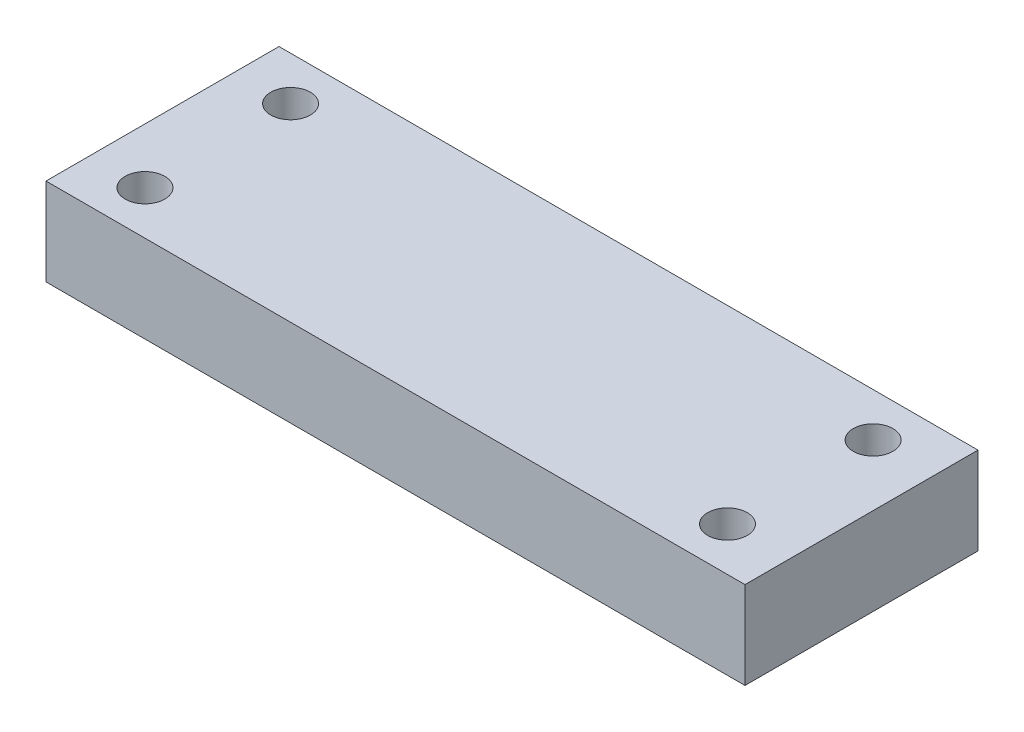
ISO-10303-21;
HEADER;
FILE_DESCRIPTION(('STEP AP214'),'2;1');
FILE_NAME('part.step','',(''),(''),'','','');
FILE_SCHEMA(('AUTOMOTIVE_DESIGN { 1 0 10303 214 1 1 1 1 }'));
ENDSEC;
DATA;
#1=APPLICATION_CONTEXT('core data for automotive mechanical design processes');
#2=APPLICATION_PROTOCOL_DEFINITION('international standard','automotive_design',2000,#1);
#3=PRODUCT_CONTEXT('',#1,'mechanical');
#4=PRODUCT('Part','Part','',(#3));
#5=PRODUCT_RELATED_PRODUCT_CATEGORY('part','',(#4));
#6=PRODUCT_DEFINITION_FORMATION('','',#4);
#7=PRODUCT_DEFINITION_CONTEXT('part definition',#1,'design');
#8=PRODUCT_DEFINITION('design','',#6,#7);
#9=PRODUCT_DEFINITION_SHAPE('','',#8);
#10=(LENGTH_UNIT() NAMED_UNIT(*) SI_UNIT(.MILLI.,.METRE.));
#11=(NAMED_UNIT(*) PLANE_ANGLE_UNIT() SI_UNIT($,.RADIAN.));
#12=(NAMED_UNIT(*) SI_UNIT($,.STERADIAN.) SOLID_ANGLE_UNIT());
#13=UNCERTAINTY_MEASURE_WITH_UNIT(LENGTH_MEASURE(1.E-05),#10,'distance_accuracy_value','');
#14=(GEOMETRIC_REPRESENTATION_CONTEXT(3) GLOBAL_UNCERTAINTY_ASSIGNED_CONTEXT((#13)) GLOBAL_UNIT_ASSIGNED_CONTEXT((#10,
#11,#12)) REPRESENTATION_CONTEXT('',''));
#15=CARTESIAN_POINT('',(0.,0.,0.));
#16=DIRECTION('',(0.,0.,1.));
#17=DIRECTION('',(1.,0.,0.));
#18=AXIS2_PLACEMENT_3D('',#15,#16,#17);
#19=CARTESIAN_POINT('',(-38.1,9.525,-12.7));
#20=DIRECTION('',(1.,0.,0.));
#21=DIRECTION('',(0.,0.,-1.));
#22=AXIS2_PLACEMENT_3D('',#19,#20,#21);
#23=PLANE('',#22);
#24=DIRECTION('',(0.,0.,1.));
#25=VECTOR('',#24,1.);
#26=CARTESIAN_POINT('',(-38.1,0.,-12.7));
#27=LINE('',#26,#25);
#28=CARTESIAN_POINT('',(-38.1,0.,-12.7));
#29=VERTEX_POINT('',#28);
#30=CARTESIAN_POINT('',(-38.1,0.,12.7));
#31=VERTEX_POINT('',#30);
#32=EDGE_CURVE('E98',#29,#31,#27,.T.);
#33=ORIENTED_EDGE('',*,*,#32,.T.);
#34=DIRECTION('',(0.,-1.,0.));
#35=VECTOR('',#34,1.);
#36=CARTESIAN_POINT('',(-38.1,9.525,12.7));
#37=LINE('',#36,#35);
#38=CARTESIAN_POINT('',(-38.1,9.525,12.7));
#39=VERTEX_POINT('',#38);
#40=EDGE_CURVE('E11',#39,#31,#37,.T.);
#41=ORIENTED_EDGE('',*,*,#40,.F.);
#42=DIRECTION('',(0.,0.,1.));
#43=VECTOR('',#42,1.);
#44=CARTESIAN_POINT('',(-38.1,9.525,-12.7));
#45=LINE('',#44,#43);
#46=CARTESIAN_POINT('',(-38.1,9.525,-12.7));
#47=VERTEX_POINT('',#46);
#48=EDGE_CURVE('E86',#47,#39,#45,.T.);
#49=ORIENTED_EDGE('',*,*,#48,.F.);
#50=DIRECTION('',(0.,-1.,0.));
#51=VECTOR('',#50,1.);
#52=CARTESIAN_POINT('',(-38.1,9.525,-12.7));
#53=LINE('',#52,#51);
#54=EDGE_CURVE('E94',#47,#29,#53,.T.);
#55=ORIENTED_EDGE('',*,*,#54,.T.);
#56=EDGE_LOOP('',(#33,#41,#49,#55));
#57=FACE_BOUND('',#56,.T.);
#58=ADVANCED_FACE('F35',(#57),#23,.F.);
#59=CARTESIAN_POINT('',(-38.1,9.525,12.7));
#60=DIRECTION('',(0.,0.,-1.));
#61=DIRECTION('',(-1.,0.,0.));
#62=AXIS2_PLACEMENT_3D('',#59,#60,#61);
#63=PLANE('',#62);
#64=DIRECTION('',(1.,0.,0.));
#65=VECTOR('',#64,1.);
#66=CARTESIAN_POINT('',(-38.1,0.,12.7));
#67=LINE('',#66,#65);
#68=CARTESIAN_POINT('',(38.1,0.,12.7));
#69=VERTEX_POINT('',#68);
#70=EDGE_CURVE('E90',#31,#69,#67,.T.);
#71=ORIENTED_EDGE('',*,*,#70,.T.);
#72=DIRECTION('',(0.,-1.,0.));
#73=VECTOR('',#72,1.);
#74=CARTESIAN_POINT('',(38.1,9.525,12.7));
#75=LINE('',#74,#73);
#76=CARTESIAN_POINT('',(38.1,9.525,12.7));
#77=VERTEX_POINT('',#76);
#78=EDGE_CURVE('E43',#77,#69,#75,.T.);
#79=ORIENTED_EDGE('',*,*,#78,.F.);
#80=DIRECTION('',(1.,0.,0.));
#81=VECTOR('',#80,1.);
#82=CARTESIAN_POINT('',(-38.1,9.525,12.7));
#83=LINE('',#82,#81);
#84=EDGE_CURVE('E81',#39,#77,#83,.T.);
#85=ORIENTED_EDGE('',*,*,#84,.F.);
#86=ORIENTED_EDGE('',*,*,#40,.T.);
#87=EDGE_LOOP('',(#71,#79,#85,#86));
#88=FACE_BOUND('',#87,.T.);
#89=ADVANCED_FACE('F89',(#88),#63,.F.);
#90=CARTESIAN_POINT('',(38.1,9.525,-12.7));
#91=DIRECTION('',(-1.,0.,0.));
#92=DIRECTION('',(0.,0.,1.));
#93=AXIS2_PLACEMENT_3D('',#90,#91,#92);
#94=PLANE('',#93);
#95=DIRECTION('',(0.,0.,-1.));
#96=VECTOR('',#95,1.);
#97=CARTESIAN_POINT('',(38.1,0.,-12.7));
#98=LINE('',#97,#96);
#99=CARTESIAN_POINT('',(38.1,0.,-12.7));
#100=VERTEX_POINT('',#99);
#101=EDGE_CURVE('E68',#69,#100,#98,.T.);
#102=ORIENTED_EDGE('',*,*,#101,.T.);
#103=DIRECTION('',(0.,-1.,0.));
#104=VECTOR('',#103,1.);
#105=CARTESIAN_POINT('',(38.1,9.525,-12.7));
#106=LINE('',#105,#104);
#107=CARTESIAN_POINT('',(38.1,9.525,-12.7));
#108=VERTEX_POINT('',#107);
#109=EDGE_CURVE('E91',#108,#100,#106,.T.);
#110=ORIENTED_EDGE('',*,*,#109,.F.);
#111=DIRECTION('',(0.,0.,-1.));
#112=VECTOR('',#111,1.);
#113=CARTESIAN_POINT('',(38.1,9.525,-12.7));
#114=LINE('',#113,#112);
#115=EDGE_CURVE('E84',#77,#108,#114,.T.);
#116=ORIENTED_EDGE('',*,*,#115,.F.);
#117=ORIENTED_EDGE('',*,*,#78,.T.);
#118=EDGE_LOOP('',(#102,#110,#116,#117));
#119=FACE_BOUND('',#118,.T.);
#120=ADVANCED_FACE('F92',(#119),#94,.F.);
#121=CARTESIAN_POINT('',(-38.1,9.525,-12.7));
#122=DIRECTION('',(0.,0.,1.));
#123=DIRECTION('',(1.,0.,0.));
#124=AXIS2_PLACEMENT_3D('',#121,#122,#123);
#125=PLANE('',#124);
#126=DIRECTION('',(-1.,0.,0.));
#127=VECTOR('',#126,1.);
#128=CARTESIAN_POINT('',(-38.1,0.,-12.7));
#129=LINE('',#128,#127);
#130=EDGE_CURVE('E74',#100,#29,#129,.T.);
#131=ORIENTED_EDGE('',*,*,#130,.T.);
#132=ORIENTED_EDGE('',*,*,#54,.F.);
#133=DIRECTION('',(-1.,0.,0.));
#134=VECTOR('',#133,1.);
#135=CARTESIAN_POINT('',(-38.1,9.525,-12.7));
#136=LINE('',#135,#134);
#137=EDGE_CURVE('E51',#108,#47,#136,.T.);
#138=ORIENTED_EDGE('',*,*,#137,.F.);
#139=ORIENTED_EDGE('',*,*,#109,.T.);
#140=EDGE_LOOP('',(#131,#132,#138,#139));
#141=FACE_BOUND('',#140,.T.);
#142=ADVANCED_FACE('F106',(#141),#125,.F.);
#143=CARTESIAN_POINT('',(0.,9.525,0.));
#144=DIRECTION('',(0.,1.,0.));
#145=DIRECTION('',(0.,0.,1.));
#146=AXIS2_PLACEMENT_3D('',#143,#144,#145);
#147=PLANE('',#146);
#148=CARTESIAN_POINT('',(31.4259241176133,9.525,7.9375));
#149=DIRECTION('',(0.,1.,0.));
#150=DIRECTION('',(0.,0.,1.));
#151=AXIS2_PLACEMENT_3D('',#148,#149,#150);
#152=CIRCLE('',#151,2.159);
#153=CARTESIAN_POINT('',(31.4259241176133,9.525,10.0965));
#154=VERTEX_POINT('',#153);
#155=EDGE_CURVE('E130',#154,#154,#152,.T.);
#156=ORIENTED_EDGE('',*,*,#155,.F.);
#157=EDGE_LOOP('',(#156));
#158=FACE_BOUND('',#157,.T.);
#159=CARTESIAN_POINT('',(31.4259241176133,9.525,-7.9375));
#160=DIRECTION('',(0.,1.,0.));
#161=DIRECTION('',(0.,0.,1.));
#162=AXIS2_PLACEMENT_3D('',#159,#160,#161);
#163=CIRCLE('',#162,2.159);
#164=CARTESIAN_POINT('',(31.4259241176133,9.525,-5.7785));
#165=VERTEX_POINT('',#164);
#166=EDGE_CURVE('E124',#165,#165,#163,.T.);
#167=ORIENTED_EDGE('',*,*,#166,.F.);
#168=EDGE_LOOP('',(#167));
#169=FACE_BOUND('',#168,.T.);
#170=CARTESIAN_POINT('',(-32.0740758823868,9.525,7.9375));
#171=DIRECTION('',(0.,1.,0.));
#172=DIRECTION('',(0.,0.,1.));
#173=AXIS2_PLACEMENT_3D('',#170,#171,#172);
#174=CIRCLE('',#173,2.159);
#175=CARTESIAN_POINT('',(-32.0740758823868,9.525,10.0965));
#176=VERTEX_POINT('',#175);
#177=EDGE_CURVE('E118',#176,#176,#174,.T.);
#178=ORIENTED_EDGE('',*,*,#177,.F.);
#179=EDGE_LOOP('',(#178));
#180=FACE_BOUND('',#179,.T.);
#181=CARTESIAN_POINT('',(-32.0740758823868,9.525,-7.9375));
#182=DIRECTION('',(0.,1.,0.));
#183=DIRECTION('',(0.,0.,1.));
#184=AXIS2_PLACEMENT_3D('',#181,#182,#183);
#185=CIRCLE('',#184,2.159);
#186=CARTESIAN_POINT('',(-32.0740758823868,9.525,-5.7785));
#187=VERTEX_POINT('',#186);
#188=EDGE_CURVE('E112',#187,#187,#185,.T.);
#189=ORIENTED_EDGE('',*,*,#188,.F.);
#190=EDGE_LOOP('',(#189));
#191=FACE_BOUND('',#190,.T.);
#192=ORIENTED_EDGE('',*,*,#48,.T.);
#193=ORIENTED_EDGE('',*,*,#84,.T.);
#194=ORIENTED_EDGE('',*,*,#115,.T.);
#195=ORIENTED_EDGE('',*,*,#137,.T.);
#196=EDGE_LOOP('',(#192,#193,#194,#195));
#197=FACE_BOUND('',#196,.T.);
#198=ADVANCED_FACE('F82',(#158,#169,#180,#191,#197),#147,.T.);
#199=CARTESIAN_POINT('',(0.,0.,0.));
#200=DIRECTION('',(0.,1.,0.));
#201=DIRECTION('',(0.,0.,1.));
#202=AXIS2_PLACEMENT_3D('',#199,#200,#201);
#203=PLANE('',#202);
#204=CARTESIAN_POINT('',(31.4259241176133,0.,7.9375));
#205=DIRECTION('',(0.,1.,0.));
#206=DIRECTION('',(0.,0.,1.));
#207=AXIS2_PLACEMENT_3D('',#204,#205,#206);
#208=CIRCLE('',#207,2.159);
#209=CARTESIAN_POINT('',(31.4259241176133,0.,10.0965));
#210=VERTEX_POINT('',#209);
#211=EDGE_CURVE('E127',#210,#210,#208,.T.);
#212=ORIENTED_EDGE('',*,*,#211,.T.);
#213=EDGE_LOOP('',(#212));
#214=FACE_BOUND('',#213,.T.);
#215=CARTESIAN_POINT('',(31.4259241176133,0.,-7.9375));
#216=DIRECTION('',(0.,1.,0.));
#217=DIRECTION('',(0.,0.,1.));
#218=AXIS2_PLACEMENT_3D('',#215,#216,#217);
#219=CIRCLE('',#218,2.159);
#220=CARTESIAN_POINT('',(31.4259241176133,0.,-5.7785));
#221=VERTEX_POINT('',#220);
#222=EDGE_CURVE('E121',#221,#221,#219,.T.);
#223=ORIENTED_EDGE('',*,*,#222,.T.);
#224=EDGE_LOOP('',(#223));
#225=FACE_BOUND('',#224,.T.);
#226=CARTESIAN_POINT('',(-32.0740758823868,0.,7.9375));
#227=DIRECTION('',(0.,1.,0.));
#228=DIRECTION('',(0.,0.,1.));
#229=AXIS2_PLACEMENT_3D('',#226,#227,#228);
#230=CIRCLE('',#229,2.159);
#231=CARTESIAN_POINT('',(-32.0740758823868,0.,10.0965));
#232=VERTEX_POINT('',#231);
#233=EDGE_CURVE('E115',#232,#232,#230,.T.);
#234=ORIENTED_EDGE('',*,*,#233,.T.);
#235=EDGE_LOOP('',(#234));
#236=FACE_BOUND('',#235,.T.);
#237=CARTESIAN_POINT('',(-32.0740758823868,0.,-7.9375));
#238=DIRECTION('',(0.,1.,0.));
#239=DIRECTION('',(0.,0.,1.));
#240=AXIS2_PLACEMENT_3D('',#237,#238,#239);
#241=CIRCLE('',#240,2.159);
#242=CARTESIAN_POINT('',(-32.0740758823868,0.,-5.7785));
#243=VERTEX_POINT('',#242);
#244=EDGE_CURVE('E101',#243,#243,#241,.T.);
#245=ORIENTED_EDGE('',*,*,#244,.T.);
#246=EDGE_LOOP('',(#245));
#247=FACE_BOUND('',#246,.T.);
#248=ORIENTED_EDGE('',*,*,#32,.F.);
#249=ORIENTED_EDGE('',*,*,#130,.F.);
#250=ORIENTED_EDGE('',*,*,#101,.F.);
#251=ORIENTED_EDGE('',*,*,#70,.F.);
#252=EDGE_LOOP('',(#248,#249,#250,#251));
#253=FACE_BOUND('',#252,.T.);
#254=ADVANCED_FACE('F109',(#214,#225,#236,#247,#253),#203,.F.);
#255=CARTESIAN_POINT('',(-32.0740758823868,0.,-7.9375));
#256=DIRECTION('',(0.,1.,0.));
#257=DIRECTION('',(0.,0.,1.));
#258=AXIS2_PLACEMENT_3D('',#255,#256,#257);
#259=CYLINDRICAL_SURFACE('',#258,2.159);
#260=CARTESIAN_POINT('',(-32.0740758823868,0.,-5.7785));
#261=CARTESIAN_POINT('',(-32.0740758823868,0.0992187499999999,-5.7785));
#262=CARTESIAN_POINT('',(-32.0740758823868,0.1984375,-5.7785));
#263=CARTESIAN_POINT('',(-32.0740758823868,0.396875,-5.7785));
#264=CARTESIAN_POINT('',(-32.0740758823868,0.49609375,-5.7785));
#265=CARTESIAN_POINT('',(-32.0740758823868,0.69453125,-5.7785));
#266=CARTESIAN_POINT('',(-32.0740758823868,0.79375,-5.7785));
#267=CARTESIAN_POINT('',(-32.0740758823868,0.9921875,-5.7785));
#268=CARTESIAN_POINT('',(-32.0740758823868,1.09140625,-5.7785));
#269=CARTESIAN_POINT('',(-32.0740758823868,1.28984375,-5.7785));
#270=CARTESIAN_POINT('',(-32.0740758823868,1.3890625,-5.7785));
#271=CARTESIAN_POINT('',(-32.0740758823868,1.5875,-5.7785));
#272=CARTESIAN_POINT('',(-32.0740758823868,1.68671875,-5.7785));
#273=CARTESIAN_POINT('',(-32.0740758823868,1.88515625,-5.7785));
#274=CARTESIAN_POINT('',(-32.0740758823868,1.984375,-5.7785));
#275=CARTESIAN_POINT('',(-32.0740758823868,2.1828125,-5.7785));
#276=CARTESIAN_POINT('',(-32.0740758823868,2.28203125,-5.7785));
#277=CARTESIAN_POINT('',(-32.0740758823868,2.48046875,-5.7785));
#278=CARTESIAN_POINT('',(-32.0740758823868,2.5796875,-5.7785));
#279=CARTESIAN_POINT('',(-32.0740758823868,2.778125,-5.7785));
#280=CARTESIAN_POINT('',(-32.0740758823868,2.87734375,-5.7785));
#281=CARTESIAN_POINT('',(-32.0740758823868,3.07578125,-5.7785));
#282=CARTESIAN_POINT('',(-32.0740758823868,3.175,-5.7785));
#283=CARTESIAN_POINT('',(-32.0740758823868,3.3734375,-5.7785));
#284=CARTESIAN_POINT('',(-32.0740758823868,3.47265625,-5.7785));
#285=CARTESIAN_POINT('',(-32.0740758823868,3.67109375,-5.7785));
#286=CARTESIAN_POINT('',(-32.0740758823868,3.7703125,-5.7785));
#287=CARTESIAN_POINT('',(-32.0740758823868,3.96875,-5.7785));
#288=CARTESIAN_POINT('',(-32.0740758823868,4.06796875,-5.7785));
#289=CARTESIAN_POINT('',(-32.0740758823868,4.26640625,-5.7785));
#290=CARTESIAN_POINT('',(-32.0740758823868,4.365625,-5.7785));
#291=CARTESIAN_POINT('',(-32.0740758823868,4.5640625,-5.7785));
#292=CARTESIAN_POINT('',(-32.0740758823868,4.66328125,-5.7785));
#293=CARTESIAN_POINT('',(-32.0740758823868,4.86171875,-5.7785));
#294=CARTESIAN_POINT('',(-32.0740758823868,4.9609375,-5.7785));
#295=CARTESIAN_POINT('',(-32.0740758823868,5.159375,-5.7785));
#296=CARTESIAN_POINT('',(-32.0740758823868,5.25859375,-5.7785));
#297=CARTESIAN_POINT('',(-32.0740758823868,5.45703125,-5.7785));
#298=CARTESIAN_POINT('',(-32.0740758823868,5.55625,-5.7785));
#299=CARTESIAN_POINT('',(-32.0740758823868,5.7546875,-5.7785));
#300=CARTESIAN_POINT('',(-32.0740758823868,5.85390625,-5.7785));
#301=CARTESIAN_POINT('',(-32.0740758823868,6.05234375,-5.7785));
#302=CARTESIAN_POINT('',(-32.0740758823868,6.1515625,-5.7785));
#303=CARTESIAN_POINT('',(-32.0740758823868,6.35,-5.7785));
#304=CARTESIAN_POINT('',(-32.0740758823868,6.44921875,-5.7785));
#305=CARTESIAN_POINT('',(-32.0740758823868,6.64765625,-5.7785));
#306=CARTESIAN_POINT('',(-32.0740758823868,6.746875,-5.7785));
#307=CARTESIAN_POINT('',(-32.0740758823868,6.9453125,-5.7785));
#308=CARTESIAN_POINT('',(-32.0740758823868,7.04453125,-5.7785));
#309=CARTESIAN_POINT('',(-32.0740758823868,7.24296875,-5.7785));
#310=CARTESIAN_POINT('',(-32.0740758823868,7.3421875,-5.7785));
#311=CARTESIAN_POINT('',(-32.0740758823868,7.540625,-5.7785));
#312=CARTESIAN_POINT('',(-32.0740758823868,7.63984375,-5.7785));
#313=CARTESIAN_POINT('',(-32.0740758823868,7.83828125,-5.7785));
#314=CARTESIAN_POINT('',(-32.0740758823868,7.9375,-5.7785));
#315=CARTESIAN_POINT('',(-32.0740758823868,8.1359375,-5.7785));
#316=CARTESIAN_POINT('',(-32.0740758823868,8.23515625,-5.7785));
#317=CARTESIAN_POINT('',(-32.0740758823868,8.43359375,-5.7785));
#318=CARTESIAN_POINT('',(-32.0740758823868,8.5328125,-5.7785));
#319=CARTESIAN_POINT('',(-32.0740758823868,8.73125,-5.7785));
#320=CARTESIAN_POINT('',(-32.0740758823868,8.83046875,-5.7785));
#321=CARTESIAN_POINT('',(-32.0740758823868,9.02890625,-5.7785));
#322=CARTESIAN_POINT('',(-32.0740758823868,9.128125,-5.7785));
#323=CARTESIAN_POINT('',(-32.0740758823868,9.3265625,-5.7785));
#324=CARTESIAN_POINT('',(-32.0740758823868,9.42578125,-5.7785));
#325=CARTESIAN_POINT('',(-32.0740758823868,9.525,-5.7785));
#326=B_SPLINE_CURVE_WITH_KNOTS('',3,(#260,#261,#262,#263,#264,#265,#266,#267,#268,#269,#270,
#271,#272,#273,#274,#275,#276,#277,#278,#279,#280,#281,#282,#283,#284,#285,#286,#287,#288,#289,
#290,#291,#292,#293,#294,#295,#296,#297,#298,#299,#300,#301,#302,#303,#304,#305,#306,#307,#308,
#309,#310,#311,#312,#313,#314,#315,#316,#317,#318,#319,#320,#321,#322,#323,#324,#325),
.UNSPECIFIED.,.F.,.F.,(4,2,2,2,2,2,2,2,2,2,2,2,2,2,2,2,2,2,2,2,2,2,2,2,2,2,2,2,2,2,2,2,4),(0.,
0.29765625,0.5953125,0.89296875,1.190625,1.48828125,1.7859375,2.08359375,2.38125,2.67890625,
2.9765625,3.27421875,3.571875,3.86953125,4.1671875,4.46484375,4.7625,5.06015625,5.3578125,
5.65546875,5.953125,6.25078125,6.5484375,6.84609375,7.14375,7.44140625,7.7390625,8.03671875,
8.334375,8.63203125,8.9296875,9.22734375,9.525),.UNSPECIFIED.);
#327=EDGE_CURVE('BSEAM154',#243,#187,#326,.T.);
#328=ORIENTED_EDGE('',*,*,#244,.F.);
#329=ORIENTED_EDGE('',*,*,#188,.T.);
#330=ORIENTED_EDGE('',*,*,#327,.T.);
#331=ORIENTED_EDGE('',*,*,#327,.F.);
#332=EDGE_LOOP('',(#328,#330,#329,#331));
#333=FACE_BOUND('',#332,.T.);
#334=ADVANCED_FACE('F154',(#333),#259,.F.);
#335=CARTESIAN_POINT('',(-32.0740758823868,0.,7.9375));
#336=DIRECTION('',(0.,1.,0.));
#337=DIRECTION('',(0.,0.,1.));
#338=AXIS2_PLACEMENT_3D('',#335,#336,#337);
#339=CYLINDRICAL_SURFACE('',#338,2.159);
#340=CARTESIAN_POINT('',(-32.0740758823868,0.,10.0965));
#341=CARTESIAN_POINT('',(-32.0740758823868,0.0992187499999999,10.0965));
#342=CARTESIAN_POINT('',(-32.0740758823868,0.1984375,10.0965));
#343=CARTESIAN_POINT('',(-32.0740758823868,0.396875,10.0965));
#344=CARTESIAN_POINT('',(-32.0740758823868,0.49609375,10.0965));
#345=CARTESIAN_POINT('',(-32.0740758823868,0.69453125,10.0965));
#346=CARTESIAN_POINT('',(-32.0740758823868,0.79375,10.0965));
#347=CARTESIAN_POINT('',(-32.0740758823868,0.9921875,10.0965));
#348=CARTESIAN_POINT('',(-32.0740758823868,1.09140625,10.0965));
#349=CARTESIAN_POINT('',(-32.0740758823868,1.28984375,10.0965));
#350=CARTESIAN_POINT('',(-32.0740758823868,1.3890625,10.0965));
#351=CARTESIAN_POINT('',(-32.0740758823868,1.5875,10.0965));
#352=CARTESIAN_POINT('',(-32.0740758823868,1.68671875,10.0965));
#353=CARTESIAN_POINT('',(-32.0740758823868,1.88515625,10.0965));
#354=CARTESIAN_POINT('',(-32.0740758823868,1.984375,10.0965));
#355=CARTESIAN_POINT('',(-32.0740758823868,2.1828125,10.0965));
#356=CARTESIAN_POINT('',(-32.0740758823868,2.28203125,10.0965));
#357=CARTESIAN_POINT('',(-32.0740758823868,2.48046875,10.0965));
#358=CARTESIAN_POINT('',(-32.0740758823868,2.5796875,10.0965));
#359=CARTESIAN_POINT('',(-32.0740758823868,2.778125,10.0965));
#360=CARTESIAN_POINT('',(-32.0740758823868,2.87734375,10.0965));
#361=CARTESIAN_POINT('',(-32.0740758823868,3.07578125,10.0965));
#362=CARTESIAN_POINT('',(-32.0740758823868,3.175,10.0965));
#363=CARTESIAN_POINT('',(-32.0740758823868,3.3734375,10.0965));
#364=CARTESIAN_POINT('',(-32.0740758823868,3.47265625,10.0965));
#365=CARTESIAN_POINT('',(-32.0740758823868,3.67109375,10.0965));
#366=CARTESIAN_POINT('',(-32.0740758823868,3.7703125,10.0965));
#367=CARTESIAN_POINT('',(-32.0740758823868,3.96875,10.0965));
#368=CARTESIAN_POINT('',(-32.0740758823868,4.06796875,10.0965));
#369=CARTESIAN_POINT('',(-32.0740758823868,4.26640625,10.0965));
#370=CARTESIAN_POINT('',(-32.0740758823868,4.365625,10.0965));
#371=CARTESIAN_POINT('',(-32.0740758823868,4.5640625,10.0965));
#372=CARTESIAN_POINT('',(-32.0740758823868,4.66328125,10.0965));
#373=CARTESIAN_POINT('',(-32.0740758823868,4.86171875,10.0965));
#374=CARTESIAN_POINT('',(-32.0740758823868,4.9609375,10.0965));
#375=CARTESIAN_POINT('',(-32.0740758823868,5.159375,10.0965));
#376=CARTESIAN_POINT('',(-32.0740758823868,5.25859375,10.0965));
#377=CARTESIAN_POINT('',(-32.0740758823868,5.45703125,10.0965));
#378=CARTESIAN_POINT('',(-32.0740758823868,5.55625,10.0965));
#379=CARTESIAN_POINT('',(-32.0740758823868,5.7546875,10.0965));
#380=CARTESIAN_POINT('',(-32.0740758823868,5.85390625,10.0965));
#381=CARTESIAN_POINT('',(-32.0740758823868,6.05234375,10.0965));
#382=CARTESIAN_POINT('',(-32.0740758823868,6.1515625,10.0965));
#383=CARTESIAN_POINT('',(-32.0740758823868,6.35,10.0965));
#384=CARTESIAN_POINT('',(-32.0740758823868,6.44921875,10.0965));
#385=CARTESIAN_POINT('',(-32.0740758823868,6.64765625,10.0965));
#386=CARTESIAN_POINT('',(-32.0740758823868,6.746875,10.0965));
#387=CARTESIAN_POINT('',(-32.0740758823868,6.9453125,10.0965));
#388=CARTESIAN_POINT('',(-32.0740758823868,7.04453125,10.0965));
#389=CARTESIAN_POINT('',(-32.0740758823868,7.24296875,10.0965));
#390=CARTESIAN_POINT('',(-32.0740758823868,7.3421875,10.0965));
#391=CARTESIAN_POINT('',(-32.0740758823868,7.540625,10.0965));
#392=CARTESIAN_POINT('',(-32.0740758823868,7.63984375,10.0965));
#393=CARTESIAN_POINT('',(-32.0740758823868,7.83828125,10.0965));
#394=CARTESIAN_POINT('',(-32.0740758823868,7.9375,10.0965));
#395=CARTESIAN_POINT('',(-32.0740758823868,8.1359375,10.0965));
#396=CARTESIAN_POINT('',(-32.0740758823868,8.23515625,10.0965));
#397=CARTESIAN_POINT('',(-32.0740758823868,8.43359375,10.0965));
#398=CARTESIAN_POINT('',(-32.0740758823868,8.5328125,10.0965));
#399=CARTESIAN_POINT('',(-32.0740758823868,8.73125,10.0965));
#400=CARTESIAN_POINT('',(-32.0740758823868,8.83046875,10.0965));
#401=CARTESIAN_POINT('',(-32.0740758823868,9.02890625,10.0965));
#402=CARTESIAN_POINT('',(-32.0740758823868,9.128125,10.0965));
#403=CARTESIAN_POINT('',(-32.0740758823868,9.3265625,10.0965));
#404=CARTESIAN_POINT('',(-32.0740758823868,9.42578125,10.0965));
#405=CARTESIAN_POINT('',(-32.0740758823868,9.525,10.0965));
#406=B_SPLINE_CURVE_WITH_KNOTS('',3,(#340,#341,#342,#343,#344,#345,#346,#347,#348,#349,#350,
#351,#352,#353,#354,#355,#356,#357,#358,#359,#360,#361,#362,#363,#364,#365,#366,#367,#368,#369,
#370,#371,#372,#373,#374,#375,#376,#377,#378,#379,#380,#381,#382,#383,#384,#385,#386,#387,#388,
#389,#390,#391,#392,#393,#394,#395,#396,#397,#398,#399,#400,#401,#402,#403,#404,#405),
.UNSPECIFIED.,.F.,.F.,(4,2,2,2,2,2,2,2,2,2,2,2,2,2,2,2,2,2,2,2,2,2,2,2,2,2,2,2,2,2,2,2,4),(0.,
0.29765625,0.5953125,0.89296875,1.190625,1.48828125,1.7859375,2.08359375,2.38125,2.67890625,
2.9765625,3.27421875,3.571875,3.86953125,4.1671875,4.46484375,4.7625,5.06015625,5.3578125,
5.65546875,5.953125,6.25078125,6.5484375,6.84609375,7.14375,7.44140625,7.7390625,8.03671875,
8.334375,8.63203125,8.9296875,9.22734375,9.525),.UNSPECIFIED.);
#407=EDGE_CURVE('BSEAM156',#232,#176,#406,.T.);
#408=ORIENTED_EDGE('',*,*,#233,.F.);
#409=ORIENTED_EDGE('',*,*,#177,.T.);
#410=ORIENTED_EDGE('',*,*,#407,.T.);
#411=ORIENTED_EDGE('',*,*,#407,.F.);
#412=EDGE_LOOP('',(#408,#410,#409,#411));
#413=FACE_BOUND('',#412,.T.);
#414=ADVANCED_FACE('F156',(#413),#339,.F.);
#415=CARTESIAN_POINT('',(31.4259241176133,0.,-7.9375));
#416=DIRECTION('',(0.,1.,0.));
#417=DIRECTION('',(0.,0.,1.));
#418=AXIS2_PLACEMENT_3D('',#415,#416,#417);
#419=CYLINDRICAL_SURFACE('',#418,2.159);
#420=CARTESIAN_POINT('',(31.4259241176133,0.,-5.7785));
#421=CARTESIAN_POINT('',(31.4259241176133,0.0992187499999999,-5.7785));
#422=CARTESIAN_POINT('',(31.4259241176133,0.1984375,-5.7785));
#423=CARTESIAN_POINT('',(31.4259241176133,0.396875,-5.7785));
#424=CARTESIAN_POINT('',(31.4259241176133,0.49609375,-5.7785));
#425=CARTESIAN_POINT('',(31.4259241176133,0.69453125,-5.7785));
#426=CARTESIAN_POINT('',(31.4259241176133,0.79375,-5.7785));
#427=CARTESIAN_POINT('',(31.4259241176133,0.9921875,-5.7785));
#428=CARTESIAN_POINT('',(31.4259241176133,1.09140625,-5.7785));
#429=CARTESIAN_POINT('',(31.4259241176133,1.28984375,-5.7785));
#430=CARTESIAN_POINT('',(31.4259241176133,1.3890625,-5.7785));
#431=CARTESIAN_POINT('',(31.4259241176133,1.5875,-5.7785));
#432=CARTESIAN_POINT('',(31.4259241176133,1.68671875,-5.7785));
#433=CARTESIAN_POINT('',(31.4259241176133,1.88515625,-5.7785));
#434=CARTESIAN_POINT('',(31.4259241176133,1.984375,-5.7785));
#435=CARTESIAN_POINT('',(31.4259241176133,2.1828125,-5.7785));
#436=CARTESIAN_POINT('',(31.4259241176133,2.28203125,-5.7785));
#437=CARTESIAN_POINT('',(31.4259241176133,2.48046875,-5.7785));
#438=CARTESIAN_POINT('',(31.4259241176133,2.5796875,-5.7785));
#439=CARTESIAN_POINT('',(31.4259241176133,2.778125,-5.7785));
#440=CARTESIAN_POINT('',(31.4259241176133,2.87734375,-5.7785));
#441=CARTESIAN_POINT('',(31.4259241176133,3.07578125,-5.7785));
#442=CARTESIAN_POINT('',(31.4259241176133,3.175,-5.7785));
#443=CARTESIAN_POINT('',(31.4259241176133,3.3734375,-5.7785));
#444=CARTESIAN_POINT('',(31.4259241176133,3.47265625,-5.7785));
#445=CARTESIAN_POINT('',(31.4259241176133,3.67109375,-5.7785));
#446=CARTESIAN_POINT('',(31.4259241176133,3.7703125,-5.7785));
#447=CARTESIAN_POINT('',(31.4259241176133,3.96875,-5.7785));
#448=CARTESIAN_POINT('',(31.4259241176133,4.06796875,-5.7785));
#449=CARTESIAN_POINT('',(31.4259241176133,4.26640625,-5.7785));
#450=CARTESIAN_POINT('',(31.4259241176133,4.365625,-5.7785));
#451=CARTESIAN_POINT('',(31.4259241176133,4.5640625,-5.7785));
#452=CARTESIAN_POINT('',(31.4259241176133,4.66328125,-5.7785));
#453=CARTESIAN_POINT('',(31.4259241176133,4.86171875,-5.7785));
#454=CARTESIAN_POINT('',(31.4259241176133,4.9609375,-5.7785));
#455=CARTESIAN_POINT('',(31.4259241176133,5.159375,-5.7785));
#456=CARTESIAN_POINT('',(31.4259241176133,5.25859375,-5.7785));
#457=CARTESIAN_POINT('',(31.4259241176133,5.45703125,-5.7785));
#458=CARTESIAN_POINT('',(31.4259241176133,5.55625,-5.7785));
#459=CARTESIAN_POINT('',(31.4259241176133,5.7546875,-5.7785));
#460=CARTESIAN_POINT('',(31.4259241176133,5.85390625,-5.7785));
#461=CARTESIAN_POINT('',(31.4259241176133,6.05234375,-5.7785));
#462=CARTESIAN_POINT('',(31.4259241176133,6.1515625,-5.7785));
#463=CARTESIAN_POINT('',(31.4259241176133,6.35,-5.7785));
#464=CARTESIAN_POINT('',(31.4259241176133,6.44921875,-5.7785));
#465=CARTESIAN_POINT('',(31.4259241176133,6.64765625,-5.7785));
#466=CARTESIAN_POINT('',(31.4259241176133,6.746875,-5.7785));
#467=CARTESIAN_POINT('',(31.4259241176133,6.9453125,-5.7785));
#468=CARTESIAN_POINT('',(31.4259241176133,7.04453125,-5.7785));
#469=CARTESIAN_POINT('',(31.4259241176133,7.24296875,-5.7785));
#470=CARTESIAN_POINT('',(31.4259241176133,7.3421875,-5.7785));
#471=CARTESIAN_POINT('',(31.4259241176133,7.540625,-5.7785));
#472=CARTESIAN_POINT('',(31.4259241176133,7.63984375,-5.7785));
#473=CARTESIAN_POINT('',(31.4259241176133,7.83828125,-5.7785));
#474=CARTESIAN_POINT('',(31.4259241176133,7.9375,-5.7785));
#475=CARTESIAN_POINT('',(31.4259241176133,8.1359375,-5.7785));
#476=CARTESIAN_POINT('',(31.4259241176133,8.23515625,-5.7785));
#477=CARTESIAN_POINT('',(31.4259241176133,8.43359375,-5.7785));
#478=CARTESIAN_POINT('',(31.4259241176133,8.5328125,-5.7785));
#479=CARTESIAN_POINT('',(31.4259241176133,8.73125,-5.7785));
#480=CARTESIAN_POINT('',(31.4259241176133,8.83046875,-5.7785));
#481=CARTESIAN_POINT('',(31.4259241176133,9.02890625,-5.7785));
#482=CARTESIAN_POINT('',(31.4259241176133,9.128125,-5.7785));
#483=CARTESIAN_POINT('',(31.4259241176133,9.3265625,-5.7785));
#484=CARTESIAN_POINT('',(31.4259241176133,9.42578125,-5.7785));
#485=CARTESIAN_POINT('',(31.4259241176133,9.525,-5.7785));
#486=B_SPLINE_CURVE_WITH_KNOTS('',3,(#420,#421,#422,#423,#424,#425,#426,#427,#428,#429,#430,
#431,#432,#433,#434,#435,#436,#437,#438,#439,#440,#441,#442,#443,#444,#445,#446,#447,#448,#449,
#450,#451,#452,#453,#454,#455,#456,#457,#458,#459,#460,#461,#462,#463,#464,#465,#466,#467,#468,
#469,#470,#471,#472,#473,#474,#475,#476,#477,#478,#479,#480,#481,#482,#483,#484,#485),
.UNSPECIFIED.,.F.,.F.,(4,2,2,2,2,2,2,2,2,2,2,2,2,2,2,2,2,2,2,2,2,2,2,2,2,2,2,2,2,2,2,2,4),(0.,
0.29765625,0.5953125,0.89296875,1.190625,1.48828125,1.7859375,2.08359375,2.38125,2.67890625,
2.9765625,3.27421875,3.571875,3.86953125,4.1671875,4.46484375,4.7625,5.06015625,5.3578125,
5.65546875,5.953125,6.25078125,6.5484375,6.84609375,7.14375,7.44140625,7.7390625,8.03671875,
8.334375,8.63203125,8.9296875,9.22734375,9.525),.UNSPECIFIED.);
#487=EDGE_CURVE('BSEAM141',#221,#165,#486,.T.);
#488=ORIENTED_EDGE('',*,*,#222,.F.);
#489=ORIENTED_EDGE('',*,*,#166,.T.);
#490=ORIENTED_EDGE('',*,*,#487,.T.);
#491=ORIENTED_EDGE('',*,*,#487,.F.);
#492=EDGE_LOOP('',(#488,#490,#489,#491));
#493=FACE_BOUND('',#492,.T.);
#494=ADVANCED_FACE('F141',(#493),#419,.F.);
#495=CARTESIAN_POINT('',(31.4259241176133,0.,7.9375));
#496=DIRECTION('',(0.,1.,0.));
#497=DIRECTION('',(0.,0.,1.));
#498=AXIS2_PLACEMENT_3D('',#495,#496,#497);
#499=CYLINDRICAL_SURFACE('',#498,2.159);
#500=CARTESIAN_POINT('',(31.4259241176133,0.,10.0965));
#501=CARTESIAN_POINT('',(31.4259241176133,0.0992187499999999,10.0965));
#502=CARTESIAN_POINT('',(31.4259241176133,0.1984375,10.0965));
#503=CARTESIAN_POINT('',(31.4259241176133,0.396875,10.0965));
#504=CARTESIAN_POINT('',(31.4259241176133,0.49609375,10.0965));
#505=CARTESIAN_POINT('',(31.4259241176133,0.69453125,10.0965));
#506=CARTESIAN_POINT('',(31.4259241176133,0.79375,10.0965));
#507=CARTESIAN_POINT('',(31.4259241176133,0.9921875,10.0965));
#508=CARTESIAN_POINT('',(31.4259241176133,1.09140625,10.0965));
#509=CARTESIAN_POINT('',(31.4259241176133,1.28984375,10.0965));
#510=CARTESIAN_POINT('',(31.4259241176133,1.3890625,10.0965));
#511=CARTESIAN_POINT('',(31.4259241176133,1.5875,10.0965));
#512=CARTESIAN_POINT('',(31.4259241176133,1.68671875,10.0965));
#513=CARTESIAN_POINT('',(31.4259241176133,1.88515625,10.0965));
#514=CARTESIAN_POINT('',(31.4259241176133,1.984375,10.0965));
#515=CARTESIAN_POINT('',(31.4259241176133,2.1828125,10.0965));
#516=CARTESIAN_POINT('',(31.4259241176133,2.28203125,10.0965));
#517=CARTESIAN_POINT('',(31.4259241176133,2.48046875,10.0965));
#518=CARTESIAN_POINT('',(31.4259241176133,2.5796875,10.0965));
#519=CARTESIAN_POINT('',(31.4259241176133,2.778125,10.0965));
#520=CARTESIAN_POINT('',(31.4259241176133,2.87734375,10.0965));
#521=CARTESIAN_POINT('',(31.4259241176133,3.07578125,10.0965));
#522=CARTESIAN_POINT('',(31.4259241176133,3.175,10.0965));
#523=CARTESIAN_POINT('',(31.4259241176133,3.3734375,10.0965));
#524=CARTESIAN_POINT('',(31.4259241176133,3.47265625,10.0965));
#525=CARTESIAN_POINT('',(31.4259241176133,3.67109375,10.0965));
#526=CARTESIAN_POINT('',(31.4259241176133,3.7703125,10.0965));
#527=CARTESIAN_POINT('',(31.4259241176133,3.96875,10.0965));
#528=CARTESIAN_POINT('',(31.4259241176133,4.06796875,10.0965));
#529=CARTESIAN_POINT('',(31.4259241176133,4.26640625,10.0965));
#530=CARTESIAN_POINT('',(31.4259241176133,4.365625,10.0965));
#531=CARTESIAN_POINT('',(31.4259241176133,4.5640625,10.0965));
#532=CARTESIAN_POINT('',(31.4259241176133,4.66328125,10.0965));
#533=CARTESIAN_POINT('',(31.4259241176133,4.86171875,10.0965));
#534=CARTESIAN_POINT('',(31.4259241176133,4.9609375,10.0965));
#535=CARTESIAN_POINT('',(31.4259241176133,5.159375,10.0965));
#536=CARTESIAN_POINT('',(31.4259241176133,5.25859375,10.0965));
#537=CARTESIAN_POINT('',(31.4259241176133,5.45703125,10.0965));
#538=CARTESIAN_POINT('',(31.4259241176133,5.55625,10.0965));
#539=CARTESIAN_POINT('',(31.4259241176133,5.7546875,10.0965));
#540=CARTESIAN_POINT('',(31.4259241176133,5.85390625,10.0965));
#541=CARTESIAN_POINT('',(31.4259241176133,6.05234375,10.0965));
#542=CARTESIAN_POINT('',(31.4259241176133,6.1515625,10.0965));
#543=CARTESIAN_POINT('',(31.4259241176133,6.35,10.0965));
#544=CARTESIAN_POINT('',(31.4259241176133,6.44921875,10.0965));
#545=CARTESIAN_POINT('',(31.4259241176133,6.64765625,10.0965));
#546=CARTESIAN_POINT('',(31.4259241176133,6.746875,10.0965));
#547=CARTESIAN_POINT('',(31.4259241176133,6.9453125,10.0965));
#548=CARTESIAN_POINT('',(31.4259241176133,7.04453125,10.0965));
#549=CARTESIAN_POINT('',(31.4259241176133,7.24296875,10.0965));
#550=CARTESIAN_POINT('',(31.4259241176133,7.3421875,10.0965));
#551=CARTESIAN_POINT('',(31.4259241176133,7.540625,10.0965));
#552=CARTESIAN_POINT('',(31.4259241176133,7.63984375,10.0965));
#553=CARTESIAN_POINT('',(31.4259241176133,7.83828125,10.0965));
#554=CARTESIAN_POINT('',(31.4259241176133,7.9375,10.0965));
#555=CARTESIAN_POINT('',(31.4259241176133,8.1359375,10.0965));
#556=CARTESIAN_POINT('',(31.4259241176133,8.23515625,10.0965));
#557=CARTESIAN_POINT('',(31.4259241176133,8.43359375,10.0965));
#558=CARTESIAN_POINT('',(31.4259241176133,8.5328125,10.0965));
#559=CARTESIAN_POINT('',(31.4259241176133,8.73125,10.0965));
#560=CARTESIAN_POINT('',(31.4259241176133,8.83046875,10.0965));
#561=CARTESIAN_POINT('',(31.4259241176133,9.02890625,10.0965));
#562=CARTESIAN_POINT('',(31.4259241176133,9.128125,10.0965));
#563=CARTESIAN_POINT('',(31.4259241176133,9.3265625,10.0965));
#564=CARTESIAN_POINT('',(31.4259241176133,9.42578125,10.0965));
#565=CARTESIAN_POINT('',(31.4259241176133,9.525,10.0965));
#566=B_SPLINE_CURVE_WITH_KNOTS('',3,(#500,#501,#502,#503,#504,#505,#506,#507,#508,#509,#510,
#511,#512,#513,#514,#515,#516,#517,#518,#519,#520,#521,#522,#523,#524,#525,#526,#527,#528,#529,
#530,#531,#532,#533,#534,#535,#536,#537,#538,#539,#540,#541,#542,#543,#544,#545,#546,#547,#548,
#549,#550,#551,#552,#553,#554,#555,#556,#557,#558,#559,#560,#561,#562,#563,#564,#565),
.UNSPECIFIED.,.F.,.F.,(4,2,2,2,2,2,2,2,2,2,2,2,2,2,2,2,2,2,2,2,2,2,2,2,2,2,2,2,2,2,2,2,4),(0.,
0.29765625,0.5953125,0.89296875,1.190625,1.48828125,1.7859375,2.08359375,2.38125,2.67890625,
2.9765625,3.27421875,3.571875,3.86953125,4.1671875,4.46484375,4.7625,5.06015625,5.3578125,
5.65546875,5.953125,6.25078125,6.5484375,6.84609375,7.14375,7.44140625,7.7390625,8.03671875,
8.334375,8.63203125,8.9296875,9.22734375,9.525),.UNSPECIFIED.);
#567=EDGE_CURVE('BSEAM138',#210,#154,#566,.T.);
#568=ORIENTED_EDGE('',*,*,#211,.F.);
#569=ORIENTED_EDGE('',*,*,#155,.T.);
#570=ORIENTED_EDGE('',*,*,#567,.T.);
#571=ORIENTED_EDGE('',*,*,#567,.F.);
#572=EDGE_LOOP('',(#568,#570,#569,#571));
#573=FACE_BOUND('',#572,.T.);
#574=ADVANCED_FACE('F138',(#573),#499,.F.);
#575=CLOSED_SHELL('',(#58,#89,#120,#142,#198,#254,#334,#414,#494,#574));
#576=MANIFOLD_SOLID_BREP('B2',#575);
#577=ADVANCED_BREP_SHAPE_REPRESENTATION('',(#18,#576),#14);
#578=SHAPE_DEFINITION_REPRESENTATION(#9,#577);
ENDSEC;
END-ISO-10303-21;
